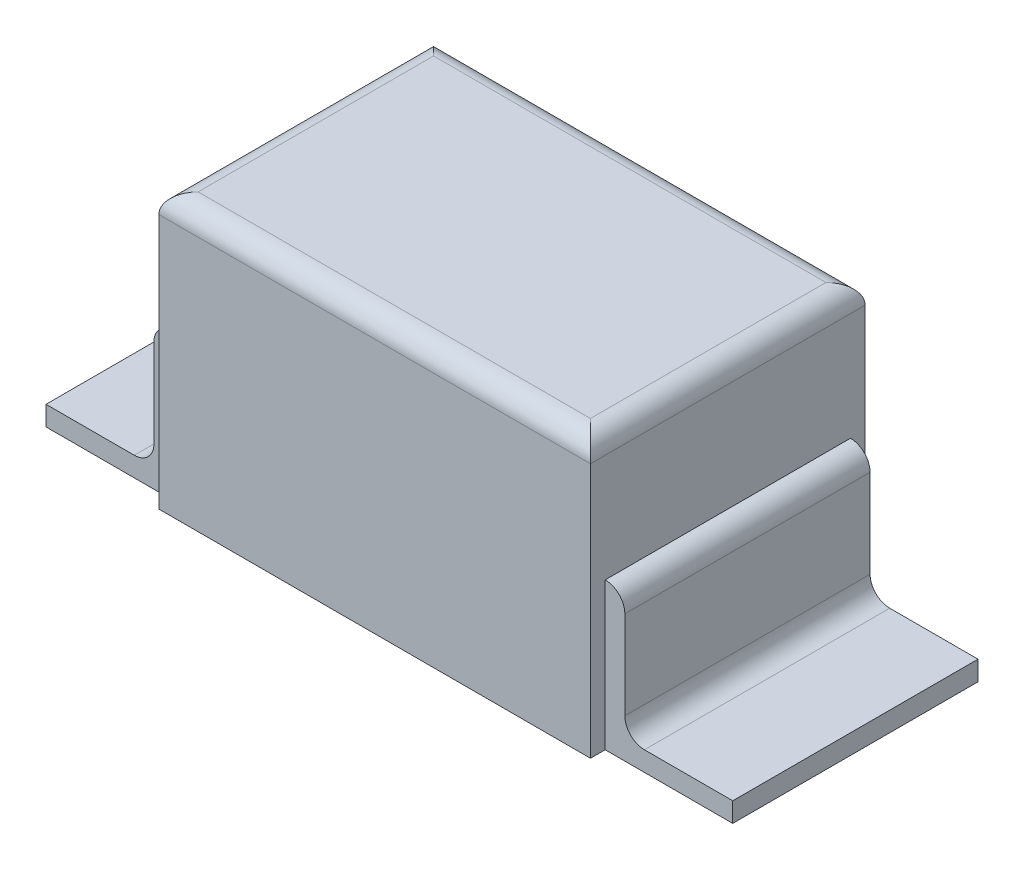
ISO-10303-21;
HEADER;
FILE_DESCRIPTION(('STEP AP214'),'2;1');
FILE_NAME('part.step','',(''),(''),'','','');
FILE_SCHEMA(('AUTOMOTIVE_DESIGN { 1 0 10303 214 1 1 1 1 }'));
ENDSEC;
DATA;
#1=APPLICATION_CONTEXT('core data for automotive mechanical design processes');
#2=APPLICATION_PROTOCOL_DEFINITION('international standard','automotive_design',2000,#1);
#3=PRODUCT_CONTEXT('',#1,'mechanical');
#4=PRODUCT('Part','Part','',(#3));
#5=PRODUCT_RELATED_PRODUCT_CATEGORY('part','',(#4));
#6=PRODUCT_DEFINITION_FORMATION('','',#4);
#7=PRODUCT_DEFINITION_CONTEXT('part definition',#1,'design');
#8=PRODUCT_DEFINITION('design','',#6,#7);
#9=PRODUCT_DEFINITION_SHAPE('','',#8);
#10=(LENGTH_UNIT() NAMED_UNIT(*) SI_UNIT(.MILLI.,.METRE.));
#11=(NAMED_UNIT(*) PLANE_ANGLE_UNIT() SI_UNIT($,.RADIAN.));
#12=(NAMED_UNIT(*) SI_UNIT($,.STERADIAN.) SOLID_ANGLE_UNIT());
#13=UNCERTAINTY_MEASURE_WITH_UNIT(LENGTH_MEASURE(1.E-05),#10,'distance_accuracy_value','');
#14=(GEOMETRIC_REPRESENTATION_CONTEXT(3) GLOBAL_UNCERTAINTY_ASSIGNED_CONTEXT((#13)) GLOBAL_UNIT_ASSIGNED_CONTEXT((#10,
#11,#12)) REPRESENTATION_CONTEXT('',''));
#15=CARTESIAN_POINT('',(0.,0.,0.));
#16=DIRECTION('',(0.,0.,1.));
#17=DIRECTION('',(1.,0.,0.));
#18=AXIS2_PLACEMENT_3D('',#15,#16,#17);
#19=CARTESIAN_POINT('',(0.70997848964325,2.175,14.3874237594195));
#20=DIRECTION('',(0.,1.,0.));
#21=DIRECTION('',(0.,0.,1.));
#22=AXIS2_PLACEMENT_3D('',#19,#20,#21);
#23=PLANE('',#22);
#24=DIRECTION('',(-1.,0.,0.));
#25=VECTOR('',#24,1.);
#26=CARTESIAN_POINT('',(1.12247848964325,2.175,13.9374237594195));
#27=LINE('',#26,#25);
#28=CARTESIAN_POINT('',(-0.04002151035675,2.175,13.9374237594195));
#29=VERTEX_POINT('',#28);
#30=CARTESIAN_POINT('',(1.45997848964325,2.175,13.9374237594195));
#31=VERTEX_POINT('',#30);
#32=EDGE_CURVE('P0_E81',#29,#31,#27,.F.);
#33=ORIENTED_EDGE('',*,*,#32,.F.);
#34=DIRECTION('',(0.,0.,1.));
#35=VECTOR('',#34,1.);
#36=CARTESIAN_POINT('',(-0.04002151035675,2.175,14.1249237594195));
#37=LINE('',#36,#35);
#38=CARTESIAN_POINT('',(-0.04002151035675,2.175,14.8374237594195));
#39=VERTEX_POINT('',#38);
#40=EDGE_CURVE('P0_E76',#39,#29,#37,.F.);
#41=ORIENTED_EDGE('',*,*,#40,.F.);
#42=DIRECTION('',(1.,0.,0.));
#43=VECTOR('',#42,1.);
#44=CARTESIAN_POINT('',(0.29747848964325,2.175,14.8374237594195));
#45=LINE('',#44,#43);
#46=CARTESIAN_POINT('',(1.45997848964325,2.175,14.8374237594195));
#47=VERTEX_POINT('',#46);
#48=EDGE_CURVE('P0_E84',#47,#39,#45,.F.);
#49=ORIENTED_EDGE('',*,*,#48,.F.);
#50=DIRECTION('',(0.,0.,-1.));
#51=VECTOR('',#50,1.);
#52=CARTESIAN_POINT('',(1.45997848964325,2.175,14.6499237594195));
#53=LINE('',#52,#51);
#54=EDGE_CURVE('P0_E89',#31,#47,#53,.F.);
#55=ORIENTED_EDGE('',*,*,#54,.F.);
#56=EDGE_LOOP('',(#33,#41,#49,#55));
#57=FACE_BOUND('',#56,.T.);
#58=ADVANCED_FACE('P0_F17',(#57),#23,.T.);
#59=CARTESIAN_POINT('',(-0.04002151035675,2.1,14.1249237594195));
#60=DIRECTION('',(0.,0.,1.));
#61=DIRECTION('',(1.,0.,0.));
#62=AXIS2_PLACEMENT_3D('',#59,#60,#61);
#63=CYLINDRICAL_SURFACE('',#62,0.0750000000000001);
#64=DIRECTION('',(0.,0.,1.));
#65=VECTOR('',#64,1.);
#66=CARTESIAN_POINT('',(-0.11502151035675,2.1,13.8624237594195));
#67=LINE('',#66,#65);
#68=CARTESIAN_POINT('',(-0.115021510356749,2.1,14.9124237594195));
#69=VERTEX_POINT('',#68);
#70=CARTESIAN_POINT('',(-0.115021510356749,2.1,13.8624237594195));
#71=VERTEX_POINT('',#70);
#72=EDGE_CURVE('P0_E78',#69,#71,#67,.F.);
#73=ORIENTED_EDGE('',*,*,#72,.F.);
#74=CARTESIAN_POINT('',(-0.04002151035675,2.1,14.8374237594195));
#75=DIRECTION('',(0.707106781186547,0.,0.707106781186547));
#76=DIRECTION('',(0.707106781186547,0.,-0.707106781186547));
#77=AXIS2_PLACEMENT_3D('',#74,#75,#76);
#78=ELLIPSE('',#77,0.106066017177982,0.0750000000000002);
#79=EDGE_CURVE('P0_E20',#39,#69,#78,.T.);
#80=ORIENTED_EDGE('',*,*,#79,.F.);
#81=ORIENTED_EDGE('',*,*,#40,.T.);
#82=CARTESIAN_POINT('',(-0.04002151035675,2.1,13.9374237594195));
#83=DIRECTION('',(-0.707106781186547,0.,0.707106781186547));
#84=DIRECTION('',(-0.707106781186547,0.,-0.707106781186547));
#85=AXIS2_PLACEMENT_3D('',#82,#83,#84);
#86=ELLIPSE('',#85,0.106066017177982,0.0750000000000002);
#87=EDGE_CURVE('P0_E94',#71,#29,#86,.F.);
#88=ORIENTED_EDGE('',*,*,#87,.F.);
#89=EDGE_LOOP('',(#73,#80,#81,#88));
#90=FACE_BOUND('',#89,.T.);
#91=ADVANCED_FACE('P0_F74',(#90),#63,.T.);
#92=CARTESIAN_POINT('',(0.29747848964325,2.1,14.8374237594195));
#93=DIRECTION('',(1.,0.,0.));
#94=DIRECTION('',(0.,0.,-1.));
#95=AXIS2_PLACEMENT_3D('',#92,#93,#94);
#96=CYLINDRICAL_SURFACE('',#95,0.0750000000000004);
#97=DIRECTION('',(1.,0.,0.));
#98=VECTOR('',#97,1.);
#99=CARTESIAN_POINT('',(-0.11502151035675,2.1,14.9124237594195));
#100=LINE('',#99,#98);
#101=CARTESIAN_POINT('',(1.53497848964325,2.1,14.9124237594195));
#102=VERTEX_POINT('',#101);
#103=EDGE_CURVE('P0_E110',#102,#69,#100,.F.);
#104=ORIENTED_EDGE('',*,*,#103,.F.);
#105=CARTESIAN_POINT('',(1.45997848964325,2.1,14.8374237594195));
#106=DIRECTION('',(0.707106781186547,0.,-0.707106781186547));
#107=DIRECTION('',(-0.707106781186547,0.,-0.707106781186547));
#108=AXIS2_PLACEMENT_3D('',#105,#106,#107);
#109=ELLIPSE('',#108,0.106066017177982,0.0750000000000003);
#110=EDGE_CURVE('P0_E67',#47,#102,#109,.T.);
#111=ORIENTED_EDGE('',*,*,#110,.F.);
#112=ORIENTED_EDGE('',*,*,#48,.T.);
#113=ORIENTED_EDGE('',*,*,#79,.T.);
#114=EDGE_LOOP('',(#104,#111,#112,#113));
#115=FACE_BOUND('',#114,.T.);
#116=ADVANCED_FACE('P0_F88',(#115),#96,.T.);
#117=CARTESIAN_POINT('',(1.45997848964325,2.1,14.6499237594195));
#118=DIRECTION('',(0.,0.,-1.));
#119=DIRECTION('',(-1.,0.,0.));
#120=AXIS2_PLACEMENT_3D('',#117,#118,#119);
#121=CYLINDRICAL_SURFACE('',#120,0.0750000000000001);
#122=DIRECTION('',(0.,0.,-1.));
#123=VECTOR('',#122,1.);
#124=CARTESIAN_POINT('',(1.53497848964325,2.1,14.9124237594195));
#125=LINE('',#124,#123);
#126=CARTESIAN_POINT('',(1.53497848964325,2.1,13.8624237594195));
#127=VERTEX_POINT('',#126);
#128=EDGE_CURVE('P0_E101',#127,#102,#125,.F.);
#129=ORIENTED_EDGE('',*,*,#128,.F.);
#130=CARTESIAN_POINT('',(1.45997848964325,2.1,13.9374237594195));
#131=DIRECTION('',(-0.707106781186547,0.,-0.707106781186547));
#132=DIRECTION('',(-0.707106781186547,0.,0.707106781186547));
#133=AXIS2_PLACEMENT_3D('',#130,#131,#132);
#134=ELLIPSE('',#133,0.106066017177982,0.0750000000000003);
#135=EDGE_CURVE('P0_E96',#31,#127,#134,.T.);
#136=ORIENTED_EDGE('',*,*,#135,.F.);
#137=ORIENTED_EDGE('',*,*,#54,.T.);
#138=ORIENTED_EDGE('',*,*,#110,.T.);
#139=EDGE_LOOP('',(#129,#136,#137,#138));
#140=FACE_BOUND('',#139,.T.);
#141=ADVANCED_FACE('P0_F100',(#140),#121,.T.);
#142=CARTESIAN_POINT('',(1.12247848964325,2.1,13.9374237594195));
#143=DIRECTION('',(-1.,0.,0.));
#144=DIRECTION('',(0.,0.,1.));
#145=AXIS2_PLACEMENT_3D('',#142,#143,#144);
#146=CYLINDRICAL_SURFACE('',#145,0.0750000000000004);
#147=DIRECTION('',(-1.,0.,0.));
#148=VECTOR('',#147,1.);
#149=CARTESIAN_POINT('',(1.53497848964325,2.1,13.8624237594195));
#150=LINE('',#149,#148);
#151=EDGE_CURVE('P0_E117',#71,#127,#150,.F.);
#152=ORIENTED_EDGE('',*,*,#151,.F.);
#153=ORIENTED_EDGE('',*,*,#87,.T.);
#154=ORIENTED_EDGE('',*,*,#32,.T.);
#155=ORIENTED_EDGE('',*,*,#135,.T.);
#156=EDGE_LOOP('',(#152,#153,#154,#155));
#157=FACE_BOUND('',#156,.T.);
#158=ADVANCED_FACE('P0_F124',(#157),#146,.T.);
#159=CARTESIAN_POINT('',(-0.11502151035675,1.125,13.8624237594195));
#160=DIRECTION('',(-1.,0.,0.));
#161=DIRECTION('',(0.,0.,1.));
#162=AXIS2_PLACEMENT_3D('',#159,#160,#161);
#163=PLANE('',#162);
#164=DIRECTION('',(0.,0.,1.));
#165=VECTOR('',#164,1.);
#166=CARTESIAN_POINT('',(-0.11502151035675,1.125,14.3874237594195));
#167=LINE('',#166,#165);
#168=CARTESIAN_POINT('',(-0.11502151035675,1.125,13.8624237594195));
#169=VERTEX_POINT('',#168);
#170=CARTESIAN_POINT('',(-0.11502151035675,1.125,14.9124237594195));
#171=VERTEX_POINT('',#170);
#172=EDGE_CURVE('P0_E131',#169,#171,#167,.T.);
#173=ORIENTED_EDGE('',*,*,#172,.T.);
#174=DIRECTION('',(0.,1.,0.));
#175=VECTOR('',#174,1.);
#176=CARTESIAN_POINT('',(-0.11502151035675,1.125,14.9124237594195));
#177=LINE('',#176,#175);
#178=EDGE_CURVE('P0_E108',#69,#171,#177,.F.);
#179=ORIENTED_EDGE('',*,*,#178,.F.);
#180=ORIENTED_EDGE('',*,*,#72,.T.);
#181=DIRECTION('',(0.,1.,0.));
#182=VECTOR('',#181,1.);
#183=CARTESIAN_POINT('',(-0.11502151035675,1.125,13.8624237594195));
#184=LINE('',#183,#182);
#185=EDGE_CURVE('P0_E127',#169,#71,#184,.T.);
#186=ORIENTED_EDGE('',*,*,#185,.F.);
#187=EDGE_LOOP('',(#173,#179,#180,#186));
#188=FACE_BOUND('',#187,.T.);
#189=ADVANCED_FACE('P0_F136',(#188),#163,.T.);
#190=CARTESIAN_POINT('',(-0.11502151035675,1.125,14.9124237594195));
#191=DIRECTION('',(0.,0.,1.));
#192=DIRECTION('',(1.,0.,0.));
#193=AXIS2_PLACEMENT_3D('',#190,#191,#192);
#194=PLANE('',#193);
#195=DIRECTION('',(1.,0.,0.));
#196=VECTOR('',#195,1.);
#197=CARTESIAN_POINT('',(0.70997848964325,1.125,14.9124237594195));
#198=LINE('',#197,#196);
#199=CARTESIAN_POINT('',(1.53497848964325,1.125,14.9124237594195));
#200=VERTEX_POINT('',#199);
#201=EDGE_CURVE('P0_E116',#171,#200,#198,.T.);
#202=ORIENTED_EDGE('',*,*,#201,.T.);
#203=DIRECTION('',(0.,1.,0.));
#204=VECTOR('',#203,1.);
#205=CARTESIAN_POINT('',(1.53497848964325,1.125,14.9124237594195));
#206=LINE('',#205,#204);
#207=EDGE_CURVE('P0_E106',#102,#200,#206,.F.);
#208=ORIENTED_EDGE('',*,*,#207,.F.);
#209=ORIENTED_EDGE('',*,*,#103,.T.);
#210=ORIENTED_EDGE('',*,*,#178,.T.);
#211=EDGE_LOOP('',(#202,#208,#209,#210));
#212=FACE_BOUND('',#211,.T.);
#213=ADVANCED_FACE('P0_F114',(#212),#194,.T.);
#214=CARTESIAN_POINT('',(1.53497848964325,1.125,14.9124237594195));
#215=DIRECTION('',(1.,0.,0.));
#216=DIRECTION('',(0.,0.,-1.));
#217=AXIS2_PLACEMENT_3D('',#214,#215,#216);
#218=PLANE('',#217);
#219=DIRECTION('',(0.,0.,1.));
#220=VECTOR('',#219,1.);
#221=CARTESIAN_POINT('',(1.53497848964325,1.125,14.3874237594195));
#222=LINE('',#221,#220);
#223=CARTESIAN_POINT('',(1.53497848964325,1.125,13.8624237594195));
#224=VERTEX_POINT('',#223);
#225=EDGE_CURVE('P0_E26',#200,#224,#222,.F.);
#226=ORIENTED_EDGE('',*,*,#225,.T.);
#227=DIRECTION('',(0.,1.,0.));
#228=VECTOR('',#227,1.);
#229=CARTESIAN_POINT('',(1.53497848964325,1.125,13.8624237594195));
#230=LINE('',#229,#228);
#231=EDGE_CURVE('P0_E34',#127,#224,#230,.F.);
#232=ORIENTED_EDGE('',*,*,#231,.F.);
#233=ORIENTED_EDGE('',*,*,#128,.T.);
#234=ORIENTED_EDGE('',*,*,#207,.T.);
#235=EDGE_LOOP('',(#226,#232,#233,#234));
#236=FACE_BOUND('',#235,.T.);
#237=ADVANCED_FACE('P0_F104',(#236),#218,.T.);
#238=CARTESIAN_POINT('',(1.53497848964325,1.125,13.8624237594195));
#239=DIRECTION('',(0.,0.,-1.));
#240=DIRECTION('',(-1.,0.,0.));
#241=AXIS2_PLACEMENT_3D('',#238,#239,#240);
#242=PLANE('',#241);
#243=DIRECTION('',(1.,0.,0.));
#244=VECTOR('',#243,1.);
#245=CARTESIAN_POINT('',(0.70997848964325,1.125,13.8624237594195));
#246=LINE('',#245,#244);
#247=EDGE_CURVE('P0_E11',#224,#169,#246,.F.);
#248=ORIENTED_EDGE('',*,*,#247,.T.);
#249=ORIENTED_EDGE('',*,*,#185,.T.);
#250=ORIENTED_EDGE('',*,*,#151,.T.);
#251=ORIENTED_EDGE('',*,*,#231,.T.);
#252=EDGE_LOOP('',(#248,#249,#250,#251));
#253=FACE_BOUND('',#252,.T.);
#254=ADVANCED_FACE('P0_F128',(#253),#242,.T.);
#255=CARTESIAN_POINT('',(0.70997848964325,1.125,14.3874237594195));
#256=DIRECTION('',(0.,1.,0.));
#257=DIRECTION('',(0.,0.,1.));
#258=AXIS2_PLACEMENT_3D('',#255,#256,#257);
#259=PLANE('',#258);
#260=ORIENTED_EDGE('',*,*,#225,.F.);
#261=ORIENTED_EDGE('',*,*,#201,.F.);
#262=ORIENTED_EDGE('',*,*,#172,.F.);
#263=ORIENTED_EDGE('',*,*,#247,.F.);
#264=EDGE_LOOP('',(#260,#261,#262,#263));
#265=FACE_BOUND('',#264,.T.);
#266=ADVANCED_FACE('P0_F138',(#265),#259,.F.);
#267=CLOSED_SHELL('',(#58,#91,#116,#141,#158,#189,#213,#237,#254,#266));
#268=MANIFOLD_SOLID_BREP('P0_B1',#267);
#269=CARTESIAN_POINT('',(1.60997848964325,1.6875,14.8561737594195));
#270=DIRECTION('',(-1.,0.,0.));
#271=DIRECTION('',(0.,-1.,0.));
#272=AXIS2_PLACEMENT_3D('',#269,#270,#271);
#273=PLANE('',#272);
#274=DIRECTION('',(0.,1.,0.));
#275=VECTOR('',#274,1.);
#276=CARTESIAN_POINT('',(1.60997848964325,1.6875,13.9186737594195));
#277=LINE('',#276,#275);
#278=CARTESIAN_POINT('',(1.60997848964325,1.275,13.9186737594195));
#279=VERTEX_POINT('',#278);
#280=CARTESIAN_POINT('',(1.60997848964325,1.6125,13.9186737594195));
#281=VERTEX_POINT('',#280);
#282=EDGE_CURVE('P1_E86',#279,#281,#277,.T.);
#283=ORIENTED_EDGE('',*,*,#282,.T.);
#284=DIRECTION('',(0.,0.,1.));
#285=VECTOR('',#284,1.);
#286=CARTESIAN_POINT('',(1.60997848964325,1.6125,14.8561737594195));
#287=LINE('',#286,#285);
#288=CARTESIAN_POINT('',(1.60997848964325,1.6125,14.8561737594195));
#289=VERTEX_POINT('',#288);
#290=EDGE_CURVE('P1_E101',#289,#281,#287,.F.);
#291=ORIENTED_EDGE('',*,*,#290,.F.);
#292=DIRECTION('',(0.,1.,0.));
#293=VECTOR('',#292,1.);
#294=CARTESIAN_POINT('',(1.60997848964325,1.6125,14.8561737594195));
#295=LINE('',#294,#293);
#296=CARTESIAN_POINT('',(1.60997848964325,1.275,14.8561737594195));
#297=VERTEX_POINT('',#296);
#298=EDGE_CURVE('P1_E131',#289,#297,#295,.F.);
#299=ORIENTED_EDGE('',*,*,#298,.T.);
#300=DIRECTION('',(0.,0.,1.));
#301=VECTOR('',#300,1.);
#302=CARTESIAN_POINT('',(1.60997848964325,1.275,14.8561737594195));
#303=LINE('',#302,#301);
#304=EDGE_CURVE('P1_E75',#297,#279,#303,.F.);
#305=ORIENTED_EDGE('',*,*,#304,.T.);
#306=EDGE_LOOP('',(#283,#291,#299,#305));
#307=FACE_BOUND('',#306,.T.);
#308=ADVANCED_FACE('P1_F17',(#307),#273,.F.);
#309=CARTESIAN_POINT('',(1.68497848964325,1.275,14.8561737594195));
#310=DIRECTION('',(0.,0.,1.));
#311=DIRECTION('',(0.,-1.,0.));
#312=AXIS2_PLACEMENT_3D('',#309,#310,#311);
#313=CYLINDRICAL_SURFACE('',#312,0.0750000000000001);
#314=DIRECTION('',(0.,0.,-1.));
#315=VECTOR('',#314,1.);
#316=CARTESIAN_POINT('',(1.68497848964325,1.2,14.8561737594195));
#317=LINE('',#316,#315);
#318=CARTESIAN_POINT('',(1.68497848964325,1.2,14.8561737594195));
#319=VERTEX_POINT('',#318);
#320=CARTESIAN_POINT('',(1.68497848964325,1.2,13.9186737594195));
#321=VERTEX_POINT('',#320);
#322=EDGE_CURVE('P1_E89',#319,#321,#317,.T.);
#323=ORIENTED_EDGE('',*,*,#322,.T.);
#324=CARTESIAN_POINT('',(1.68497848964325,1.275,13.9186737594195));
#325=DIRECTION('',(0.,0.,1.));
#326=DIRECTION('',(0.,-1.,0.));
#327=AXIS2_PLACEMENT_3D('',#324,#325,#326);
#328=CIRCLE('',#327,0.0750000000000001);
#329=EDGE_CURVE('P1_E20',#321,#279,#328,.F.);
#330=ORIENTED_EDGE('',*,*,#329,.T.);
#331=ORIENTED_EDGE('',*,*,#304,.F.);
#332=CARTESIAN_POINT('',(1.68497848964325,1.275,14.8561737594195));
#333=DIRECTION('',(0.,0.,1.));
#334=DIRECTION('',(0.,-1.,0.));
#335=AXIS2_PLACEMENT_3D('',#332,#333,#334);
#336=CIRCLE('',#335,0.0750000000000001);
#337=EDGE_CURVE('P1_E91',#297,#319,#336,.T.);
#338=ORIENTED_EDGE('',*,*,#337,.T.);
#339=EDGE_LOOP('',(#323,#330,#331,#338));
#340=FACE_BOUND('',#339,.T.);
#341=ADVANCED_FACE('P1_F90',(#340),#313,.F.);
#342=CARTESIAN_POINT('',(1.60997848964325,1.2,14.8561737594195));
#343=DIRECTION('',(0.,-1.,0.));
#344=DIRECTION('',(0.,0.,-1.));
#345=AXIS2_PLACEMENT_3D('',#342,#343,#344);
#346=PLANE('',#345);
#347=DIRECTION('',(-1.,0.,0.));
#348=VECTOR('',#347,1.);
#349=CARTESIAN_POINT('',(1.53497848964325,1.2,14.8561737594195));
#350=LINE('',#349,#348);
#351=CARTESIAN_POINT('',(2.02247848964325,1.2,14.8561737594195));
#352=VERTEX_POINT('',#351);
#353=EDGE_CURVE('P1_E118',#319,#352,#350,.F.);
#354=ORIENTED_EDGE('',*,*,#353,.T.);
#355=DIRECTION('',(0.,0.,-1.));
#356=VECTOR('',#355,1.);
#357=CARTESIAN_POINT('',(2.02247848964325,1.2,0.));
#358=LINE('',#357,#356);
#359=CARTESIAN_POINT('',(2.02247848964325,1.2,13.9186737594195));
#360=VERTEX_POINT('',#359);
#361=EDGE_CURVE('P1_E94',#360,#352,#358,.F.);
#362=ORIENTED_EDGE('',*,*,#361,.F.);
#363=DIRECTION('',(1.,0.,0.));
#364=VECTOR('',#363,1.);
#365=CARTESIAN_POINT('',(1.53497848964325,1.2,13.9186737594195));
#366=LINE('',#365,#364);
#367=EDGE_CURVE('P1_E85',#360,#321,#366,.F.);
#368=ORIENTED_EDGE('',*,*,#367,.T.);
#369=ORIENTED_EDGE('',*,*,#322,.F.);
#370=EDGE_LOOP('',(#354,#362,#368,#369));
#371=FACE_BOUND('',#370,.T.);
#372=ADVANCED_FACE('P1_F96',(#371),#346,.F.);
#373=CARTESIAN_POINT('',(2.02247848964325,0.,0.));
#374=DIRECTION('',(1.,0.,0.));
#375=DIRECTION('',(0.,0.,-1.));
#376=AXIS2_PLACEMENT_3D('',#373,#374,#375);
#377=PLANE('',#376);
#378=DIRECTION('',(0.,1.,0.));
#379=VECTOR('',#378,1.);
#380=CARTESIAN_POINT('',(2.02247848964325,1.6125,14.8561737594195));
#381=LINE('',#380,#379);
#382=CARTESIAN_POINT('',(2.02247848964325,1.125,14.8561737594195));
#383=VERTEX_POINT('',#382);
#384=EDGE_CURVE('P1_E116',#352,#383,#381,.F.);
#385=ORIENTED_EDGE('',*,*,#384,.T.);
#386=DIRECTION('',(0.,0.,1.));
#387=VECTOR('',#386,1.);
#388=CARTESIAN_POINT('',(2.02247848964325,1.125,13.9186737594195));
#389=LINE('',#388,#387);
#390=CARTESIAN_POINT('',(2.02247848964325,1.125,13.9186737594195));
#391=VERTEX_POINT('',#390);
#392=EDGE_CURVE('P1_E110',#383,#391,#389,.F.);
#393=ORIENTED_EDGE('',*,*,#392,.T.);
#394=DIRECTION('',(0.,1.,0.));
#395=VECTOR('',#394,1.);
#396=CARTESIAN_POINT('',(2.02247848964325,1.6875,13.9186737594195));
#397=LINE('',#396,#395);
#398=EDGE_CURVE('P1_E99',#391,#360,#397,.T.);
#399=ORIENTED_EDGE('',*,*,#398,.T.);
#400=ORIENTED_EDGE('',*,*,#361,.T.);
#401=EDGE_LOOP('',(#385,#393,#399,#400));
#402=FACE_BOUND('',#401,.T.);
#403=ADVANCED_FACE('P1_F206',(#402),#377,.T.);
#404=CARTESIAN_POINT('',(1.53497848964325,1.6125,14.8561737594195));
#405=DIRECTION('',(0.,0.,1.));
#406=DIRECTION('',(1.,0.,0.));
#407=AXIS2_PLACEMENT_3D('',#404,#405,#406);
#408=CYLINDRICAL_SURFACE('',#407,0.0750000000000001);
#409=DIRECTION('',(0.,0.,1.));
#410=VECTOR('',#409,1.);
#411=CARTESIAN_POINT('',(1.53497848964325,1.6875,14.3874237594195));
#412=LINE('',#411,#410);
#413=CARTESIAN_POINT('',(1.53497848964325,1.6875,14.8561737594195));
#414=VERTEX_POINT('',#413);
#415=CARTESIAN_POINT('',(1.53497848964325,1.6875,13.9186737594195));
#416=VERTEX_POINT('',#415);
#417=EDGE_CURVE('P1_E130',#414,#416,#412,.F.);
#418=ORIENTED_EDGE('',*,*,#417,.F.);
#419=CARTESIAN_POINT('',(1.53497848964325,1.6125,14.8561737594195));
#420=DIRECTION('',(0.,0.,1.));
#421=DIRECTION('',(1.,0.,0.));
#422=AXIS2_PLACEMENT_3D('',#419,#420,#421);
#423=CIRCLE('',#422,0.0750000000000001);
#424=EDGE_CURVE('P1_E127',#414,#289,#423,.F.);
#425=ORIENTED_EDGE('',*,*,#424,.T.);
#426=ORIENTED_EDGE('',*,*,#290,.T.);
#427=CARTESIAN_POINT('',(1.53497848964325,1.6125,13.9186737594195));
#428=DIRECTION('',(0.,0.,1.));
#429=DIRECTION('',(1.,0.,0.));
#430=AXIS2_PLACEMENT_3D('',#427,#428,#429);
#431=CIRCLE('',#430,0.0750000000000001);
#432=EDGE_CURVE('P1_E113',#281,#416,#431,.T.);
#433=ORIENTED_EDGE('',*,*,#432,.T.);
#434=EDGE_LOOP('',(#418,#425,#426,#433));
#435=FACE_BOUND('',#434,.T.);
#436=ADVANCED_FACE('P1_F135',(#435),#408,.T.);
#437=CARTESIAN_POINT('',(1.53497848964325,1.6875,13.9186737594195));
#438=DIRECTION('',(0.,0.,1.));
#439=DIRECTION('',(1.,0.,0.));
#440=AXIS2_PLACEMENT_3D('',#437,#438,#439);
#441=PLANE('',#440);
#442=ORIENTED_EDGE('',*,*,#432,.F.);
#443=ORIENTED_EDGE('',*,*,#282,.F.);
#444=ORIENTED_EDGE('',*,*,#329,.F.);
#445=ORIENTED_EDGE('',*,*,#367,.F.);
#446=ORIENTED_EDGE('',*,*,#398,.F.);
#447=DIRECTION('',(1.,0.,0.));
#448=VECTOR('',#447,1.);
#449=CARTESIAN_POINT('',(1.53497848964325,1.125,13.9186737594195));
#450=LINE('',#449,#448);
#451=CARTESIAN_POINT('',(1.53497848964325,1.125,13.9186737594195));
#452=VERTEX_POINT('',#451);
#453=EDGE_CURVE('P1_E112',#391,#452,#450,.F.);
#454=ORIENTED_EDGE('',*,*,#453,.T.);
#455=DIRECTION('',(0.,1.,0.));
#456=VECTOR('',#455,1.);
#457=CARTESIAN_POINT('',(1.53497848964325,1.65,13.9186737594195));
#458=LINE('',#457,#456);
#459=EDGE_CURVE('P1_E146',#416,#452,#458,.F.);
#460=ORIENTED_EDGE('',*,*,#459,.F.);
#461=EDGE_LOOP('',(#442,#443,#444,#445,#446,#454,#460));
#462=FACE_BOUND('',#461,.T.);
#463=ADVANCED_FACE('P1_F82',(#462),#441,.F.);
#464=CARTESIAN_POINT('',(1.53497848964325,1.125,13.9186737594195));
#465=DIRECTION('',(0.,1.,0.));
#466=DIRECTION('',(0.,0.,1.));
#467=AXIS2_PLACEMENT_3D('',#464,#465,#466);
#468=PLANE('',#467);
#469=ORIENTED_EDGE('',*,*,#453,.F.);
#470=ORIENTED_EDGE('',*,*,#392,.F.);
#471=DIRECTION('',(-1.,0.,0.));
#472=VECTOR('',#471,1.);
#473=CARTESIAN_POINT('',(1.53497848964325,1.125,14.8561737594195));
#474=LINE('',#473,#472);
#475=CARTESIAN_POINT('',(1.53497848964325,1.125,14.8561737594195));
#476=VERTEX_POINT('',#475);
#477=EDGE_CURVE('P1_E35',#383,#476,#474,.T.);
#478=ORIENTED_EDGE('',*,*,#477,.T.);
#479=DIRECTION('',(0.,0.,1.));
#480=VECTOR('',#479,1.);
#481=CARTESIAN_POINT('',(1.53497848964325,1.125,14.3874237594195));
#482=LINE('',#481,#480);
#483=EDGE_CURVE('P1_E26',#452,#476,#482,.T.);
#484=ORIENTED_EDGE('',*,*,#483,.F.);
#485=EDGE_LOOP('',(#469,#470,#478,#484));
#486=FACE_BOUND('',#485,.T.);
#487=ADVANCED_FACE('P1_F164',(#486),#468,.F.);
#488=CARTESIAN_POINT('',(1.53497848964325,1.6125,14.8561737594195));
#489=DIRECTION('',(0.,0.,-1.));
#490=DIRECTION('',(-1.,0.,0.));
#491=AXIS2_PLACEMENT_3D('',#488,#489,#490);
#492=PLANE('',#491);
#493=ORIENTED_EDGE('',*,*,#424,.F.);
#494=DIRECTION('',(0.,1.,0.));
#495=VECTOR('',#494,1.);
#496=CARTESIAN_POINT('',(1.53497848964325,1.65,14.8561737594195));
#497=LINE('',#496,#495);
#498=EDGE_CURVE('P1_E11',#476,#414,#497,.T.);
#499=ORIENTED_EDGE('',*,*,#498,.F.);
#500=ORIENTED_EDGE('',*,*,#477,.F.);
#501=ORIENTED_EDGE('',*,*,#384,.F.);
#502=ORIENTED_EDGE('',*,*,#353,.F.);
#503=ORIENTED_EDGE('',*,*,#337,.F.);
#504=ORIENTED_EDGE('',*,*,#298,.F.);
#505=EDGE_LOOP('',(#493,#499,#500,#501,#502,#503,#504));
#506=FACE_BOUND('',#505,.T.);
#507=ADVANCED_FACE('P1_F139',(#506),#492,.F.);
#508=CARTESIAN_POINT('',(1.53497848964325,1.65,14.3874237594195));
#509=DIRECTION('',(-1.,0.,0.));
#510=DIRECTION('',(0.,0.,1.));
#511=AXIS2_PLACEMENT_3D('',#508,#509,#510);
#512=PLANE('',#511);
#513=ORIENTED_EDGE('',*,*,#483,.T.);
#514=ORIENTED_EDGE('',*,*,#498,.T.);
#515=ORIENTED_EDGE('',*,*,#417,.T.);
#516=ORIENTED_EDGE('',*,*,#459,.T.);
#517=EDGE_LOOP('',(#513,#514,#515,#516));
#518=FACE_BOUND('',#517,.T.);
#519=ADVANCED_FACE('P1_F162',(#518),#512,.T.);
#520=CLOSED_SHELL('',(#308,#341,#372,#403,#436,#463,#487,#507,#519));
#521=MANIFOLD_SOLID_BREP('P1_B1',#520);
#522=CARTESIAN_POINT('',(-0.19002151035675,1.6875,14.8561737594195));
#523=DIRECTION('',(-1.,0.,0.));
#524=DIRECTION('',(0.,-1.,0.));
#525=AXIS2_PLACEMENT_3D('',#522,#523,#524);
#526=PLANE('',#525);
#527=DIRECTION('',(0.,0.,-1.));
#528=VECTOR('',#527,1.);
#529=CARTESIAN_POINT('',(-0.19002151035675,1.6125,14.8561737594195));
#530=LINE('',#529,#528);
#531=CARTESIAN_POINT('',(-0.19002151035675,1.6125,13.9186737594195));
#532=VERTEX_POINT('',#531);
#533=CARTESIAN_POINT('',(-0.19002151035675,1.6125,14.8561737594195));
#534=VERTEX_POINT('',#533);
#535=EDGE_CURVE('P2_E133',#532,#534,#530,.F.);
#536=ORIENTED_EDGE('',*,*,#535,.F.);
#537=DIRECTION('',(0.,1.,0.));
#538=VECTOR('',#537,1.);
#539=CARTESIAN_POINT('',(-0.19002151035675,1.6875,13.9186737594195));
#540=LINE('',#539,#538);
#541=CARTESIAN_POINT('',(-0.19002151035675,1.275,13.9186737594195));
#542=VERTEX_POINT('',#541);
#543=EDGE_CURVE('P2_E117',#542,#532,#540,.T.);
#544=ORIENTED_EDGE('',*,*,#543,.F.);
#545=DIRECTION('',(0.,0.,-1.));
#546=VECTOR('',#545,1.);
#547=CARTESIAN_POINT('',(-0.19002151035675,1.275,14.8561737594195));
#548=LINE('',#547,#546);
#549=CARTESIAN_POINT('',(-0.19002151035675,1.275,14.8561737594195));
#550=VERTEX_POINT('',#549);
#551=EDGE_CURVE('P2_E60',#542,#550,#548,.F.);
#552=ORIENTED_EDGE('',*,*,#551,.T.);
#553=DIRECTION('',(0.,1.,0.));
#554=VECTOR('',#553,1.);
#555=CARTESIAN_POINT('',(-0.19002151035675,1.6125,14.8561737594195));
#556=LINE('',#555,#554);
#557=EDGE_CURVE('P2_E98',#534,#550,#556,.F.);
#558=ORIENTED_EDGE('',*,*,#557,.F.);
#559=EDGE_LOOP('',(#536,#544,#552,#558));
#560=FACE_BOUND('',#559,.T.);
#561=ADVANCED_FACE('P2_F17',(#560),#526,.T.);
#562=CARTESIAN_POINT('',(-0.26502151035675,1.275,14.8561737594195));
#563=DIRECTION('',(0.,0.,-1.));
#564=DIRECTION('',(0.,1.,0.));
#565=AXIS2_PLACEMENT_3D('',#562,#563,#564);
#566=CYLINDRICAL_SURFACE('',#565,0.0750000000000001);
#567=CARTESIAN_POINT('',(-0.26502151035675,1.275,14.8561737594195));
#568=DIRECTION('',(0.,0.,-1.));
#569=DIRECTION('',(0.,1.,0.));
#570=AXIS2_PLACEMENT_3D('',#567,#568,#569);
#571=CIRCLE('',#570,0.0750000000000001);
#572=CARTESIAN_POINT('',(-0.26502151035675,1.2,14.8561737594195));
#573=VERTEX_POINT('',#572);
#574=EDGE_CURVE('P2_E143',#550,#573,#571,.T.);
#575=ORIENTED_EDGE('',*,*,#574,.F.);
#576=ORIENTED_EDGE('',*,*,#551,.F.);
#577=CARTESIAN_POINT('',(-0.26502151035675,1.275,13.9186737594195));
#578=DIRECTION('',(0.,0.,-1.));
#579=DIRECTION('',(0.,1.,0.));
#580=AXIS2_PLACEMENT_3D('',#577,#578,#579);
#581=CIRCLE('',#580,0.0750000000000001);
#582=CARTESIAN_POINT('',(-0.26502151035675,1.2,13.9186737594195));
#583=VERTEX_POINT('',#582);
#584=EDGE_CURVE('P2_E20',#583,#542,#581,.F.);
#585=ORIENTED_EDGE('',*,*,#584,.F.);
#586=DIRECTION('',(0.,0.,1.));
#587=VECTOR('',#586,1.);
#588=CARTESIAN_POINT('',(-0.26502151035675,1.2,14.8561737594195));
#589=LINE('',#588,#587);
#590=EDGE_CURVE('P2_E134',#573,#583,#589,.F.);
#591=ORIENTED_EDGE('',*,*,#590,.F.);
#592=EDGE_LOOP('',(#575,#576,#585,#591));
#593=FACE_BOUND('',#592,.T.);
#594=ADVANCED_FACE('P2_F166',(#593),#566,.F.);
#595=CARTESIAN_POINT('',(-0.19002151035675,1.2,14.8561737594195));
#596=DIRECTION('',(0.,1.,0.));
#597=DIRECTION('',(0.,0.,1.));
#598=AXIS2_PLACEMENT_3D('',#595,#596,#597);
#599=PLANE('',#598);
#600=DIRECTION('',(0.,0.,1.));
#601=VECTOR('',#600,1.);
#602=CARTESIAN_POINT('',(-0.60252151035675,1.2,0.));
#603=LINE('',#602,#601);
#604=CARTESIAN_POINT('',(-0.60252151035675,1.2,14.8561737594195));
#605=VERTEX_POINT('',#604);
#606=CARTESIAN_POINT('',(-0.60252151035675,1.2,13.9186737594195));
#607=VERTEX_POINT('',#606);
#608=EDGE_CURVE('P2_E71',#605,#607,#603,.F.);
#609=ORIENTED_EDGE('',*,*,#608,.F.);
#610=DIRECTION('',(1.,0.,0.));
#611=VECTOR('',#610,1.);
#612=CARTESIAN_POINT('',(-0.11502151035675,1.2,14.8561737594195));
#613=LINE('',#612,#611);
#614=EDGE_CURVE('P2_E80',#573,#605,#613,.F.);
#615=ORIENTED_EDGE('',*,*,#614,.F.);
#616=ORIENTED_EDGE('',*,*,#590,.T.);
#617=DIRECTION('',(-1.,0.,0.));
#618=VECTOR('',#617,1.);
#619=CARTESIAN_POINT('',(-0.11502151035675,1.2,13.9186737594195));
#620=LINE('',#619,#618);
#621=EDGE_CURVE('P2_E119',#607,#583,#620,.F.);
#622=ORIENTED_EDGE('',*,*,#621,.F.);
#623=EDGE_LOOP('',(#609,#615,#616,#622));
#624=FACE_BOUND('',#623,.T.);
#625=ADVANCED_FACE('P2_F165',(#624),#599,.T.);
#626=CARTESIAN_POINT('',(-0.60252151035675,0.,0.));
#627=DIRECTION('',(-1.,0.,0.));
#628=DIRECTION('',(0.,0.,1.));
#629=AXIS2_PLACEMENT_3D('',#626,#627,#628);
#630=PLANE('',#629);
#631=DIRECTION('',(0.,1.,0.));
#632=VECTOR('',#631,1.);
#633=CARTESIAN_POINT('',(-0.60252151035675,1.6875,13.9186737594195));
#634=LINE('',#633,#632);
#635=CARTESIAN_POINT('',(-0.60252151035675,1.125,13.9186737594195));
#636=VERTEX_POINT('',#635);
#637=EDGE_CURVE('P2_E122',#636,#607,#634,.T.);
#638=ORIENTED_EDGE('',*,*,#637,.F.);
#639=DIRECTION('',(0.,0.,-1.));
#640=VECTOR('',#639,1.);
#641=CARTESIAN_POINT('',(-0.60252151035675,1.125,13.9186737594195));
#642=LINE('',#641,#640);
#643=CARTESIAN_POINT('',(-0.60252151035675,1.125,14.8561737594195));
#644=VERTEX_POINT('',#643);
#645=EDGE_CURVE('P2_E95',#644,#636,#642,.T.);
#646=ORIENTED_EDGE('',*,*,#645,.F.);
#647=DIRECTION('',(0.,1.,0.));
#648=VECTOR('',#647,1.);
#649=CARTESIAN_POINT('',(-0.60252151035675,1.6125,14.8561737594195));
#650=LINE('',#649,#648);
#651=EDGE_CURVE('P2_E81',#605,#644,#650,.F.);
#652=ORIENTED_EDGE('',*,*,#651,.F.);
#653=ORIENTED_EDGE('',*,*,#608,.T.);
#654=EDGE_LOOP('',(#638,#646,#652,#653));
#655=FACE_BOUND('',#654,.T.);
#656=ADVANCED_FACE('P2_F173',(#655),#630,.T.);
#657=CARTESIAN_POINT('',(-0.11502151035675,1.6875,13.9186737594195));
#658=DIRECTION('',(0.,0.,-1.));
#659=DIRECTION('',(-1.,0.,0.));
#660=AXIS2_PLACEMENT_3D('',#657,#658,#659);
#661=PLANE('',#660);
#662=ORIENTED_EDGE('',*,*,#543,.T.);
#663=CARTESIAN_POINT('',(-0.11502151035675,1.6125,13.9186737594195));
#664=DIRECTION('',(0.,0.,-1.));
#665=DIRECTION('',(-1.,0.,0.));
#666=AXIS2_PLACEMENT_3D('',#663,#664,#665);
#667=CIRCLE('',#666,0.0750000000000001);
#668=CARTESIAN_POINT('',(-0.11502151035675,1.6875,13.9186737594195));
#669=VERTEX_POINT('',#668);
#670=EDGE_CURVE('P2_E109',#669,#532,#667,.F.);
#671=ORIENTED_EDGE('',*,*,#670,.F.);
#672=DIRECTION('',(0.,1.,0.));
#673=VECTOR('',#672,1.);
#674=CARTESIAN_POINT('',(-0.11502151035675,1.65,13.9186737594195));
#675=LINE('',#674,#673);
#676=CARTESIAN_POINT('',(-0.11502151035675,1.125,13.9186737594195));
#677=VERTEX_POINT('',#676);
#678=EDGE_CURVE('P2_E103',#669,#677,#675,.F.);
#679=ORIENTED_EDGE('',*,*,#678,.T.);
#680=DIRECTION('',(1.,0.,0.));
#681=VECTOR('',#680,1.);
#682=CARTESIAN_POINT('',(-0.11502151035675,1.125,13.9186737594195));
#683=LINE('',#682,#681);
#684=EDGE_CURVE('P2_E90',#636,#677,#683,.T.);
#685=ORIENTED_EDGE('',*,*,#684,.F.);
#686=ORIENTED_EDGE('',*,*,#637,.T.);
#687=ORIENTED_EDGE('',*,*,#621,.T.);
#688=ORIENTED_EDGE('',*,*,#584,.T.);
#689=EDGE_LOOP('',(#662,#671,#679,#685,#686,#687,#688));
#690=FACE_BOUND('',#689,.T.);
#691=ADVANCED_FACE('P2_F108',(#690),#661,.T.);
#692=CARTESIAN_POINT('',(-0.11502151035675,1.125,13.9186737594195));
#693=DIRECTION('',(0.,-1.,0.));
#694=DIRECTION('',(0.,0.,-1.));
#695=AXIS2_PLACEMENT_3D('',#692,#693,#694);
#696=PLANE('',#695);
#697=ORIENTED_EDGE('',*,*,#645,.T.);
#698=ORIENTED_EDGE('',*,*,#684,.T.);
#699=DIRECTION('',(0.,0.,1.));
#700=VECTOR('',#699,1.);
#701=CARTESIAN_POINT('',(-0.11502151035675,1.125,14.3874237594195));
#702=LINE('',#701,#700);
#703=CARTESIAN_POINT('',(-0.11502151035675,1.125,14.8561737594195));
#704=VERTEX_POINT('',#703);
#705=EDGE_CURVE('P2_E94',#677,#704,#702,.T.);
#706=ORIENTED_EDGE('',*,*,#705,.T.);
#707=DIRECTION('',(1.,0.,0.));
#708=VECTOR('',#707,1.);
#709=CARTESIAN_POINT('',(-0.11502151035675,1.125,14.8561737594195));
#710=LINE('',#709,#708);
#711=EDGE_CURVE('P2_E129',#644,#704,#710,.T.);
#712=ORIENTED_EDGE('',*,*,#711,.F.);
#713=EDGE_LOOP('',(#697,#698,#706,#712));
#714=FACE_BOUND('',#713,.T.);
#715=ADVANCED_FACE('P2_F92',(#714),#696,.T.);
#716=CARTESIAN_POINT('',(-0.11502151035675,1.6125,14.8561737594195));
#717=DIRECTION('',(0.,0.,1.));
#718=DIRECTION('',(1.,0.,0.));
#719=AXIS2_PLACEMENT_3D('',#716,#717,#718);
#720=PLANE('',#719);
#721=DIRECTION('',(0.,1.,0.));
#722=VECTOR('',#721,1.);
#723=CARTESIAN_POINT('',(-0.11502151035675,1.65,14.8561737594195));
#724=LINE('',#723,#722);
#725=CARTESIAN_POINT('',(-0.11502151035675,1.6875,14.8561737594195));
#726=VERTEX_POINT('',#725);
#727=EDGE_CURVE('P2_E26',#704,#726,#724,.T.);
#728=ORIENTED_EDGE('',*,*,#727,.T.);
#729=CARTESIAN_POINT('',(-0.11502151035675,1.6125,14.8561737594195));
#730=DIRECTION('',(0.,0.,-1.));
#731=DIRECTION('',(-1.,0.,0.));
#732=AXIS2_PLACEMENT_3D('',#729,#730,#731);
#733=CIRCLE('',#732,0.0750000000000001);
#734=EDGE_CURVE('P2_E34',#534,#726,#733,.T.);
#735=ORIENTED_EDGE('',*,*,#734,.F.);
#736=ORIENTED_EDGE('',*,*,#557,.T.);
#737=ORIENTED_EDGE('',*,*,#574,.T.);
#738=ORIENTED_EDGE('',*,*,#614,.T.);
#739=ORIENTED_EDGE('',*,*,#651,.T.);
#740=ORIENTED_EDGE('',*,*,#711,.T.);
#741=EDGE_LOOP('',(#728,#735,#736,#737,#738,#739,#740));
#742=FACE_BOUND('',#741,.T.);
#743=ADVANCED_FACE('P2_F158',(#742),#720,.T.);
#744=CARTESIAN_POINT('',(-0.11502151035675,1.6125,14.8561737594195));
#745=DIRECTION('',(0.,0.,-1.));
#746=DIRECTION('',(-1.,0.,0.));
#747=AXIS2_PLACEMENT_3D('',#744,#745,#746);
#748=CYLINDRICAL_SURFACE('',#747,0.0750000000000001);
#749=DIRECTION('',(0.,0.,1.));
#750=VECTOR('',#749,1.);
#751=CARTESIAN_POINT('',(-0.11502151035675,1.6875,14.3874237594195));
#752=LINE('',#751,#750);
#753=EDGE_CURVE('P2_E11',#726,#669,#752,.F.);
#754=ORIENTED_EDGE('',*,*,#753,.T.);
#755=ORIENTED_EDGE('',*,*,#670,.T.);
#756=ORIENTED_EDGE('',*,*,#535,.T.);
#757=ORIENTED_EDGE('',*,*,#734,.T.);
#758=EDGE_LOOP('',(#754,#755,#756,#757));
#759=FACE_BOUND('',#758,.T.);
#760=ADVANCED_FACE('P2_F160',(#759),#748,.T.);
#761=CARTESIAN_POINT('',(-0.11502151035675,1.65,14.3874237594195));
#762=DIRECTION('',(-1.,0.,0.));
#763=DIRECTION('',(0.,0.,1.));
#764=AXIS2_PLACEMENT_3D('',#761,#762,#763);
#765=PLANE('',#764);
#766=ORIENTED_EDGE('',*,*,#727,.F.);
#767=ORIENTED_EDGE('',*,*,#705,.F.);
#768=ORIENTED_EDGE('',*,*,#678,.F.);
#769=ORIENTED_EDGE('',*,*,#753,.F.);
#770=EDGE_LOOP('',(#766,#767,#768,#769));
#771=FACE_BOUND('',#770,.T.);
#772=ADVANCED_FACE('P2_F102',(#771),#765,.F.);
#773=CLOSED_SHELL('',(#561,#594,#625,#656,#691,#715,#743,#760,#772));
#774=MANIFOLD_SOLID_BREP('P2_B1',#773);
#775=ADVANCED_BREP_SHAPE_REPRESENTATION('',(#18,#268,#521,#774),#14);
#776=SHAPE_DEFINITION_REPRESENTATION(#9,#775);
ENDSEC;
END-ISO-10303-21;
